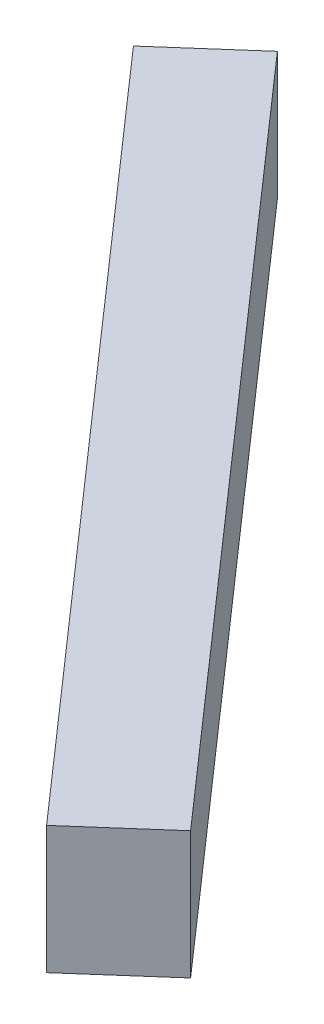
ISO-10303-21;
HEADER;
FILE_DESCRIPTION(('STEP AP214'),'2;1');
FILE_NAME('part.step','',(''),(''),'','','');
FILE_SCHEMA(('AUTOMOTIVE_DESIGN { 1 0 10303 214 1 1 1 1 }'));
ENDSEC;
DATA;
#1=APPLICATION_CONTEXT('core data for automotive mechanical design processes');
#2=APPLICATION_PROTOCOL_DEFINITION('international standard','automotive_design',2000,#1);
#3=PRODUCT_CONTEXT('',#1,'mechanical');
#4=PRODUCT('Part','Part','',(#3));
#5=PRODUCT_RELATED_PRODUCT_CATEGORY('part','',(#4));
#6=PRODUCT_DEFINITION_FORMATION('','',#4);
#7=PRODUCT_DEFINITION_CONTEXT('part definition',#1,'design');
#8=PRODUCT_DEFINITION('design','',#6,#7);
#9=PRODUCT_DEFINITION_SHAPE('','',#8);
#10=(LENGTH_UNIT() NAMED_UNIT(*) SI_UNIT(.MILLI.,.METRE.));
#11=(NAMED_UNIT(*) PLANE_ANGLE_UNIT() SI_UNIT($,.RADIAN.));
#12=(NAMED_UNIT(*) SI_UNIT($,.STERADIAN.) SOLID_ANGLE_UNIT());
#13=UNCERTAINTY_MEASURE_WITH_UNIT(LENGTH_MEASURE(1.E-05),#10,'distance_accuracy_value','');
#14=(GEOMETRIC_REPRESENTATION_CONTEXT(3) GLOBAL_UNCERTAINTY_ASSIGNED_CONTEXT((#13)) GLOBAL_UNIT_ASSIGNED_CONTEXT((#10,
#11,#12)) REPRESENTATION_CONTEXT('',''));
#15=CARTESIAN_POINT('',(0.,0.,0.));
#16=DIRECTION('',(0.,0.,1.));
#17=DIRECTION('',(1.,0.,0.));
#18=AXIS2_PLACEMENT_3D('',#15,#16,#17);
#19=CARTESIAN_POINT('',(11.9597047359082,7.874,13.4499999400684));
#20=DIRECTION('',(-0.751018338452404,0.,0.660281345570349));
#21=DIRECTION('',(0.660281345570349,0.,0.751018338452404));
#22=AXIS2_PLACEMENT_3D('',#19,#20,#21);
#23=PLANE('',#22);
#24=DIRECTION('',(0.,1.,0.));
#25=VECTOR('',#24,1.);
#26=CARTESIAN_POINT('',(11.9597047359082,7.874,13.4499999400684));
#27=LINE('',#26,#25);
#28=CARTESIAN_POINT('',(11.9597047359082,7.62,13.4499999400684));
#29=VERTEX_POINT('',#28);
#30=CARTESIAN_POINT('',(11.9597047359082,7.874,13.4499999400684));
#31=VERTEX_POINT('',#30);
#32=EDGE_CURVE('E20',#29,#31,#27,.T.);
#33=ORIENTED_EDGE('',*,*,#32,.T.);
#34=DIRECTION('',(0.660281345570352,0.,0.751018338452401));
#35=VECTOR('',#34,1.);
#36=CARTESIAN_POINT('',(11.9597047359082,7.874,13.4499999400684));
#37=LINE('',#36,#35);
#38=CARTESIAN_POINT('',(13.2175406992197,7.874,14.8806898748202));
#39=VERTEX_POINT('',#38);
#40=EDGE_CURVE('E55',#31,#39,#37,.T.);
#41=ORIENTED_EDGE('',*,*,#40,.T.);
#42=DIRECTION('',(0.,1.,0.));
#43=VECTOR('',#42,1.);
#44=CARTESIAN_POINT('',(13.2175406992197,7.874,14.8806898748202));
#45=LINE('',#44,#43);
#46=CARTESIAN_POINT('',(13.2175406992197,7.62,14.8806898748202));
#47=VERTEX_POINT('',#46);
#48=EDGE_CURVE('E76',#39,#47,#45,.F.);
#49=ORIENTED_EDGE('',*,*,#48,.T.);
#50=DIRECTION('',(0.660281345570352,0.,0.751018338452401));
#51=VECTOR('',#50,1.);
#52=CARTESIAN_POINT('',(11.9597047359082,7.62,13.4499999400684));
#53=LINE('',#52,#51);
#54=EDGE_CURVE('E58',#29,#47,#53,.T.);
#55=ORIENTED_EDGE('',*,*,#54,.F.);
#56=EDGE_LOOP('',(#33,#41,#49,#55));
#57=FACE_BOUND('',#56,.T.);
#58=ADVANCED_FACE('F17',(#57),#23,.F.);
#59=CARTESIAN_POINT('',(11.9597047359082,7.874,13.4499999400684));
#60=DIRECTION('',(0.660281345570333,0.,0.751018338452418));
#61=DIRECTION('',(0.751018338452418,0.,-0.660281345570333));
#62=AXIS2_PLACEMENT_3D('',#59,#60,#61);
#63=PLANE('',#62);
#64=DIRECTION('',(0.,1.,0.));
#65=VECTOR('',#64,1.);
#66=CARTESIAN_POINT('',(11.8070978095347,7.874,13.5841691094883));
#67=LINE('',#66,#65);
#68=CARTESIAN_POINT('',(11.8070978095347,7.62,13.5841691094883));
#69=VERTEX_POINT('',#68);
#70=CARTESIAN_POINT('',(11.8070978095347,7.874,13.5841691094883));
#71=VERTEX_POINT('',#70);
#72=EDGE_CURVE('E73',#69,#71,#67,.T.);
#73=ORIENTED_EDGE('',*,*,#72,.T.);
#74=DIRECTION('',(0.751018338452331,0.,-0.660281345570432));
#75=VECTOR('',#74,1.);
#76=CARTESIAN_POINT('',(11.8070978095347,7.874,13.5841691094883));
#77=LINE('',#76,#75);
#78=EDGE_CURVE('E63',#71,#31,#77,.T.);
#79=ORIENTED_EDGE('',*,*,#78,.T.);
#80=ORIENTED_EDGE('',*,*,#32,.F.);
#81=DIRECTION('',(0.751018338452331,0.,-0.660281345570432));
#82=VECTOR('',#81,1.);
#83=CARTESIAN_POINT('',(11.8070978095347,7.62,13.5841691094883));
#84=LINE('',#83,#82);
#85=EDGE_CURVE('E80',#69,#29,#84,.T.);
#86=ORIENTED_EDGE('',*,*,#85,.F.);
#87=EDGE_LOOP('',(#73,#79,#80,#86));
#88=FACE_BOUND('',#87,.T.);
#89=ADVANCED_FACE('F72',(#88),#63,.F.);
#90=CARTESIAN_POINT('',(11.9597047359082,7.874,13.4499999400684));
#91=DIRECTION('',(0.,-1.,0.));
#92=DIRECTION('',(0.,0.,-1.));
#93=AXIS2_PLACEMENT_3D('',#90,#91,#92);
#94=PLANE('',#93);
#95=ORIENTED_EDGE('',*,*,#78,.F.);
#96=DIRECTION('',(-0.660281345570348,0.,-0.751018338452404));
#97=VECTOR('',#96,1.);
#98=CARTESIAN_POINT('',(11.8070978095347,7.874,13.5841691094883));
#99=LINE('',#98,#97);
#100=CARTESIAN_POINT('',(13.0649337730504,7.874,15.0148590444724));
#101=VERTEX_POINT('',#100);
#102=EDGE_CURVE('E83',#71,#101,#99,.F.);
#103=ORIENTED_EDGE('',*,*,#102,.T.);
#104=DIRECTION('',(-0.751018337447232,0.,0.660281346713653));
#105=VECTOR('',#104,1.);
#106=CARTESIAN_POINT('',(13.2175406992197,7.874,14.8806898748202));
#107=LINE('',#106,#105);
#108=EDGE_CURVE('E69',#101,#39,#107,.F.);
#109=ORIENTED_EDGE('',*,*,#108,.T.);
#110=ORIENTED_EDGE('',*,*,#40,.F.);
#111=EDGE_LOOP('',(#95,#103,#109,#110));
#112=FACE_BOUND('',#111,.T.);
#113=ADVANCED_FACE('F66',(#112),#94,.F.);
#114=CARTESIAN_POINT('',(13.2175406992197,7.874,14.8806898748202));
#115=DIRECTION('',(-0.660281346713653,0.,-0.751018337447232));
#116=DIRECTION('',(-0.751018337447232,0.,0.660281346713653));
#117=AXIS2_PLACEMENT_3D('',#114,#115,#116);
#118=PLANE('',#117);
#119=ORIENTED_EDGE('',*,*,#48,.F.);
#120=ORIENTED_EDGE('',*,*,#108,.F.);
#121=DIRECTION('',(0.,1.,0.));
#122=VECTOR('',#121,1.);
#123=CARTESIAN_POINT('',(13.0649337730504,7.874,15.0148590444724));
#124=LINE('',#123,#122);
#125=CARTESIAN_POINT('',(13.0649337730504,7.62,15.0148590444724));
#126=VERTEX_POINT('',#125);
#127=EDGE_CURVE('E26',#101,#126,#124,.F.);
#128=ORIENTED_EDGE('',*,*,#127,.T.);
#129=DIRECTION('',(-0.75101833744732,0.,0.660281346713553));
#130=VECTOR('',#129,1.);
#131=CARTESIAN_POINT('',(13.2175406992197,7.62,14.8806898748202));
#132=LINE('',#131,#130);
#133=EDGE_CURVE('E34',#47,#126,#132,.T.);
#134=ORIENTED_EDGE('',*,*,#133,.F.);
#135=EDGE_LOOP('',(#119,#120,#128,#134));
#136=FACE_BOUND('',#135,.T.);
#137=ADVANCED_FACE('F88',(#136),#118,.F.);
#138=CARTESIAN_POINT('',(11.9597047359082,7.62,13.4499999400684));
#139=DIRECTION('',(0.,-1.,0.));
#140=DIRECTION('',(0.,0.,-1.));
#141=AXIS2_PLACEMENT_3D('',#138,#139,#140);
#142=PLANE('',#141);
#143=DIRECTION('',(-0.660281345570348,0.,-0.751018338452404));
#144=VECTOR('',#143,1.);
#145=CARTESIAN_POINT('',(11.8070978095347,7.62,13.5841691094883));
#146=LINE('',#145,#144);
#147=EDGE_CURVE('E11',#126,#69,#146,.T.);
#148=ORIENTED_EDGE('',*,*,#147,.T.);
#149=ORIENTED_EDGE('',*,*,#85,.T.);
#150=ORIENTED_EDGE('',*,*,#54,.T.);
#151=ORIENTED_EDGE('',*,*,#133,.T.);
#152=EDGE_LOOP('',(#148,#149,#150,#151));
#153=FACE_BOUND('',#152,.T.);
#154=ADVANCED_FACE('F91',(#153),#142,.T.);
#155=CARTESIAN_POINT('',(11.8070978095347,7.874,13.5841691094883));
#156=DIRECTION('',(0.751018338452404,0.,-0.660281345570348));
#157=DIRECTION('',(-0.660281345570348,0.,-0.751018338452404));
#158=AXIS2_PLACEMENT_3D('',#155,#156,#157);
#159=PLANE('',#158);
#160=ORIENTED_EDGE('',*,*,#127,.F.);
#161=ORIENTED_EDGE('',*,*,#102,.F.);
#162=ORIENTED_EDGE('',*,*,#72,.F.);
#163=ORIENTED_EDGE('',*,*,#147,.F.);
#164=EDGE_LOOP('',(#160,#161,#162,#163));
#165=FACE_BOUND('',#164,.T.);
#166=ADVANCED_FACE('F90',(#165),#159,.F.);
#167=CLOSED_SHELL('',(#58,#89,#113,#137,#154,#166));
#168=MANIFOLD_SOLID_BREP('B1',#167);
#169=ADVANCED_BREP_SHAPE_REPRESENTATION('',(#18,#168),#14);
#170=SHAPE_DEFINITION_REPRESENTATION(#9,#169);
ENDSEC;
END-ISO-10303-21;
